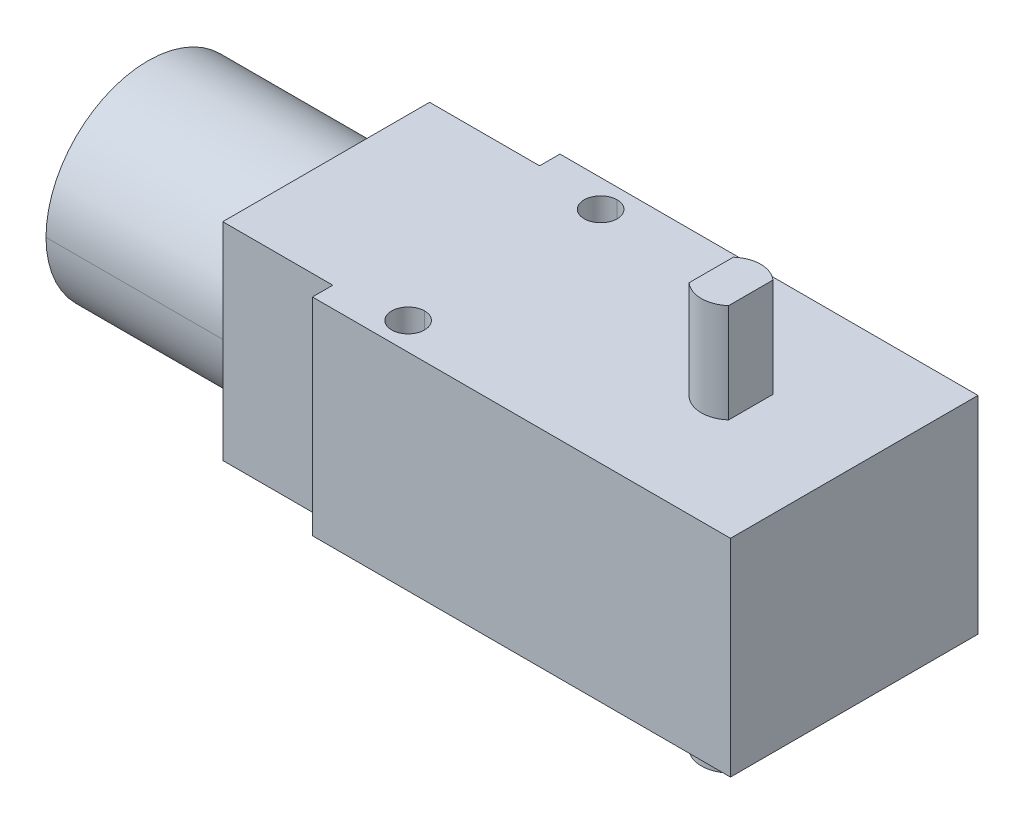
ISO-10303-21;
HEADER;
FILE_DESCRIPTION(('STEP AP214'),'2;1');
FILE_NAME('part.step','',(''),(''),'','','');
FILE_SCHEMA(('AUTOMOTIVE_DESIGN { 1 0 10303 214 1 1 1 1 }'));
ENDSEC;
DATA;
#1=APPLICATION_CONTEXT('core data for automotive mechanical design processes');
#2=APPLICATION_PROTOCOL_DEFINITION('international standard','automotive_design',2000,#1);
#3=PRODUCT_CONTEXT('',#1,'mechanical');
#4=PRODUCT('Part','Part','',(#3));
#5=PRODUCT_RELATED_PRODUCT_CATEGORY('part','',(#4));
#6=PRODUCT_DEFINITION_FORMATION('','',#4);
#7=PRODUCT_DEFINITION_CONTEXT('part definition',#1,'design');
#8=PRODUCT_DEFINITION('design','',#6,#7);
#9=PRODUCT_DEFINITION_SHAPE('','',#8);
#10=(LENGTH_UNIT() NAMED_UNIT(*) SI_UNIT(.MILLI.,.METRE.));
#11=(NAMED_UNIT(*) PLANE_ANGLE_UNIT() SI_UNIT($,.RADIAN.));
#12=(NAMED_UNIT(*) SI_UNIT($,.STERADIAN.) SOLID_ANGLE_UNIT());
#13=UNCERTAINTY_MEASURE_WITH_UNIT(LENGTH_MEASURE(1.E-05),#10,'distance_accuracy_value','');
#14=(GEOMETRIC_REPRESENTATION_CONTEXT(3) GLOBAL_UNCERTAINTY_ASSIGNED_CONTEXT((#13)) GLOBAL_UNIT_ASSIGNED_CONTEXT((#10,
#11,#12)) REPRESENTATION_CONTEXT('',''));
#15=CARTESIAN_POINT('',(0.,0.,0.));
#16=DIRECTION('',(0.,0.,1.));
#17=DIRECTION('',(1.,0.,0.));
#18=AXIS2_PLACEMENT_3D('',#15,#16,#17);
#19=CARTESIAN_POINT('',(0.,0.,0.));
#20=DIRECTION('',(0.,1.,0.));
#21=DIRECTION('',(1.,0.,0.));
#22=AXIS2_PLACEMENT_3D('',#19,#20,#21);
#23=PLANE('',#22);
#24=DIRECTION('',(0.,0.,-1.));
#25=VECTOR('',#24,1.);
#26=CARTESIAN_POINT('',(19.,0.,-11.25));
#27=LINE('',#26,#25);
#28=CARTESIAN_POINT('',(19.,0.,11.25));
#29=VERTEX_POINT('',#28);
#30=CARTESIAN_POINT('',(19.,0.,-11.25));
#31=VERTEX_POINT('',#30);
#32=EDGE_CURVE('E366',#29,#31,#27,.T.);
#33=ORIENTED_EDGE('',*,*,#32,.F.);
#34=DIRECTION('',(1.,0.,0.));
#35=VECTOR('',#34,1.);
#36=CARTESIAN_POINT('',(-19.,0.,11.25));
#37=LINE('',#36,#35);
#38=CARTESIAN_POINT('',(-19.,0.,11.25));
#39=VERTEX_POINT('',#38);
#40=EDGE_CURVE('E346',#39,#29,#37,.T.);
#41=ORIENTED_EDGE('',*,*,#40,.F.);
#42=DIRECTION('',(0.,0.,1.));
#43=VECTOR('',#42,1.);
#44=CARTESIAN_POINT('',(-19.,0.,-11.25));
#45=LINE('',#44,#43);
#46=CARTESIAN_POINT('',(-19.,0.,9.4));
#47=VERTEX_POINT('',#46);
#48=EDGE_CURVE('E320',#47,#39,#45,.T.);
#49=ORIENTED_EDGE('',*,*,#48,.F.);
#50=DIRECTION('',(1.,0.,0.));
#51=VECTOR('',#50,1.);
#52=CARTESIAN_POINT('',(-29.,0.,9.4));
#53=LINE('',#52,#51);
#54=CARTESIAN_POINT('',(-29.,0.,9.4));
#55=VERTEX_POINT('',#54);
#56=EDGE_CURVE('E354',#55,#47,#53,.T.);
#57=ORIENTED_EDGE('',*,*,#56,.F.);
#58=DIRECTION('',(0.,0.,1.));
#59=VECTOR('',#58,1.);
#60=CARTESIAN_POINT('',(-29.,0.,-9.4));
#61=LINE('',#60,#59);
#62=CARTESIAN_POINT('',(-29.,0.,-9.4));
#63=VERTEX_POINT('',#62);
#64=EDGE_CURVE('E357',#63,#55,#61,.T.);
#65=ORIENTED_EDGE('',*,*,#64,.F.);
#66=DIRECTION('',(1.,0.,0.));
#67=VECTOR('',#66,1.);
#68=CARTESIAN_POINT('',(-29.,0.,-9.4));
#69=LINE('',#68,#67);
#70=CARTESIAN_POINT('',(-19.,0.,-9.4));
#71=VERTEX_POINT('',#70);
#72=EDGE_CURVE('E385',#63,#71,#69,.T.);
#73=ORIENTED_EDGE('',*,*,#72,.T.);
#74=DIRECTION('',(0.,0.,1.));
#75=VECTOR('',#74,1.);
#76=CARTESIAN_POINT('',(-19.,0.,-11.25));
#77=LINE('',#76,#75);
#78=CARTESIAN_POINT('',(-19.,0.,-11.25));
#79=VERTEX_POINT('',#78);
#80=EDGE_CURVE('E362',#79,#71,#77,.T.);
#81=ORIENTED_EDGE('',*,*,#80,.F.);
#82=DIRECTION('',(-1.,0.,0.));
#83=VECTOR('',#82,1.);
#84=CARTESIAN_POINT('',(-19.,0.,-11.25));
#85=LINE('',#84,#83);
#86=EDGE_CURVE('E347',#31,#79,#85,.T.);
#87=ORIENTED_EDGE('',*,*,#86,.F.);
#88=EDGE_LOOP('',(#33,#41,#49,#57,#65,#73,#81,#87));
#89=FACE_BOUND('',#88,.T.);
#90=CARTESIAN_POINT('',(-12.8,0.,-8.75));
#91=DIRECTION('',(0.,1.,0.));
#92=DIRECTION('',(0.,0.,1.));
#93=AXIS2_PLACEMENT_3D('',#90,#91,#92);
#94=CIRCLE('',#93,1.5);
#95=CARTESIAN_POINT('',(-12.8,0.,-7.25));
#96=VERTEX_POINT('',#95);
#97=CARTESIAN_POINT('',(-12.8,0.,-10.25));
#98=VERTEX_POINT('',#97);
#99=EDGE_CURVE('E428',#96,#98,#94,.T.);
#100=ORIENTED_EDGE('',*,*,#99,.T.);
#101=CARTESIAN_POINT('',(-12.8,0.,-8.75));
#102=DIRECTION('',(0.,1.,0.));
#103=DIRECTION('',(0.,0.,1.));
#104=AXIS2_PLACEMENT_3D('',#101,#102,#103);
#105=CIRCLE('',#104,1.5);
#106=EDGE_CURVE('E291',#98,#96,#105,.T.);
#107=ORIENTED_EDGE('',*,*,#106,.T.);
#108=EDGE_LOOP('',(#100,#107));
#109=FACE_BOUND('',#108,.T.);
#110=CARTESIAN_POINT('',(-12.8,0.,8.75));
#111=DIRECTION('',(0.,1.,0.));
#112=DIRECTION('',(0.,0.,1.));
#113=AXIS2_PLACEMENT_3D('',#110,#111,#112);
#114=CIRCLE('',#113,1.5);
#115=CARTESIAN_POINT('',(-12.8,0.,10.25));
#116=VERTEX_POINT('',#115);
#117=CARTESIAN_POINT('',(-12.8,0.,7.25));
#118=VERTEX_POINT('',#117);
#119=EDGE_CURVE('E431',#116,#118,#114,.T.);
#120=ORIENTED_EDGE('',*,*,#119,.T.);
#121=CARTESIAN_POINT('',(-12.8,0.,8.75));
#122=DIRECTION('',(0.,1.,0.));
#123=DIRECTION('',(0.,0.,1.));
#124=AXIS2_PLACEMENT_3D('',#121,#122,#123);
#125=CIRCLE('',#124,1.5);
#126=EDGE_CURVE('E324',#118,#116,#125,.T.);
#127=ORIENTED_EDGE('',*,*,#126,.T.);
#128=EDGE_LOOP('',(#120,#127));
#129=FACE_BOUND('',#128,.T.);
#130=CARTESIAN_POINT('',(7.8,0.,0.));
#131=DIRECTION('',(0.,-1.,0.));
#132=DIRECTION('',(0.,0.,-1.));
#133=AXIS2_PLACEMENT_3D('',#130,#131,#132);
#134=CIRCLE('',#133,2.7);
#135=CARTESIAN_POINT('',(9.6,0.,2.01246117974981));
#136=VERTEX_POINT('',#135);
#137=CARTESIAN_POINT('',(6.,0.,2.01246117974981));
#138=VERTEX_POINT('',#137);
#139=EDGE_CURVE('E230',#136,#138,#134,.T.);
#140=ORIENTED_EDGE('',*,*,#139,.F.);
#141=DIRECTION('',(0.,0.,1.));
#142=VECTOR('',#141,1.);
#143=CARTESIAN_POINT('',(9.6,0.,2.01246117974981));
#144=LINE('',#143,#142);
#145=CARTESIAN_POINT('',(9.6,0.,-2.01246117974981));
#146=VERTEX_POINT('',#145);
#147=EDGE_CURVE('E263',#146,#136,#144,.T.);
#148=ORIENTED_EDGE('',*,*,#147,.F.);
#149=CARTESIAN_POINT('',(7.8,0.,0.));
#150=DIRECTION('',(0.,-1.,0.));
#151=DIRECTION('',(0.,0.,-1.));
#152=AXIS2_PLACEMENT_3D('',#149,#150,#151);
#153=CIRCLE('',#152,2.7);
#154=CARTESIAN_POINT('',(6.,0.,-2.01246117974981));
#155=VERTEX_POINT('',#154);
#156=EDGE_CURVE('E275',#155,#146,#153,.T.);
#157=ORIENTED_EDGE('',*,*,#156,.F.);
#158=DIRECTION('',(0.,0.,-1.));
#159=VECTOR('',#158,1.);
#160=CARTESIAN_POINT('',(6.,0.,2.01246117974981));
#161=LINE('',#160,#159);
#162=EDGE_CURVE('E272',#138,#155,#161,.T.);
#163=ORIENTED_EDGE('',*,*,#162,.F.);
#164=EDGE_LOOP('',(#140,#148,#157,#163));
#165=FACE_BOUND('',#164,.T.);
#166=ADVANCED_FACE('F45',(#89,#109,#129,#165),#23,.F.);
#167=CARTESIAN_POINT('',(-12.8,0.,-8.75));
#168=DIRECTION('',(0.,1.,0.));
#169=DIRECTION('',(0.,0.,1.));
#170=AXIS2_PLACEMENT_3D('',#167,#168,#169);
#171=CYLINDRICAL_SURFACE('',#170,1.5);
#172=DIRECTION('',(0.,1.,0.));
#173=VECTOR('',#172,1.);
#174=CARTESIAN_POINT('',(-12.8,0.,-10.25));
#175=LINE('',#174,#173);
#176=CARTESIAN_POINT('',(-12.8,18.8,-10.25));
#177=VERTEX_POINT('',#176);
#178=EDGE_CURVE('E298',#98,#177,#175,.T.);
#179=ORIENTED_EDGE('',*,*,#178,.F.);
#180=ORIENTED_EDGE('',*,*,#99,.F.);
#181=DIRECTION('',(0.,1.,0.));
#182=VECTOR('',#181,1.);
#183=CARTESIAN_POINT('',(-12.8,0.,-7.25));
#184=LINE('',#183,#182);
#185=CARTESIAN_POINT('',(-12.8,18.8,-7.25));
#186=VERTEX_POINT('',#185);
#187=EDGE_CURVE('E314',#96,#186,#184,.T.);
#188=ORIENTED_EDGE('',*,*,#187,.T.);
#189=CARTESIAN_POINT('',(-12.8,18.8,-8.75));
#190=DIRECTION('',(0.,1.,0.));
#191=DIRECTION('',(0.,0.,1.));
#192=AXIS2_PLACEMENT_3D('',#189,#190,#191);
#193=CIRCLE('',#192,1.5);
#194=EDGE_CURVE('E421',#186,#177,#193,.T.);
#195=ORIENTED_EDGE('',*,*,#194,.T.);
#196=EDGE_LOOP('',(#179,#180,#188,#195));
#197=FACE_BOUND('',#196,.T.);
#198=ADVANCED_FACE('F47',(#197),#171,.F.);
#199=CARTESIAN_POINT('',(-12.8,0.,8.75));
#200=DIRECTION('',(0.,1.,0.));
#201=DIRECTION('',(0.,0.,1.));
#202=AXIS2_PLACEMENT_3D('',#199,#200,#201);
#203=CYLINDRICAL_SURFACE('',#202,1.5);
#204=DIRECTION('',(0.,1.,0.));
#205=VECTOR('',#204,1.);
#206=CARTESIAN_POINT('',(-12.8,0.,7.25));
#207=LINE('',#206,#205);
#208=CARTESIAN_POINT('',(-12.8,18.8,7.25));
#209=VERTEX_POINT('',#208);
#210=EDGE_CURVE('E328',#118,#209,#207,.T.);
#211=ORIENTED_EDGE('',*,*,#210,.F.);
#212=ORIENTED_EDGE('',*,*,#119,.F.);
#213=DIRECTION('',(0.,1.,0.));
#214=VECTOR('',#213,1.);
#215=CARTESIAN_POINT('',(-12.8,0.,10.25));
#216=LINE('',#215,#214);
#217=CARTESIAN_POINT('',(-12.8,18.8,10.25));
#218=VERTEX_POINT('',#217);
#219=EDGE_CURVE('E339',#116,#218,#216,.T.);
#220=ORIENTED_EDGE('',*,*,#219,.T.);
#221=CARTESIAN_POINT('',(-12.8,18.8,8.75));
#222=DIRECTION('',(0.,1.,0.));
#223=DIRECTION('',(0.,0.,1.));
#224=AXIS2_PLACEMENT_3D('',#221,#222,#223);
#225=CIRCLE('',#224,1.5);
#226=EDGE_CURVE('E358',#218,#209,#225,.T.);
#227=ORIENTED_EDGE('',*,*,#226,.T.);
#228=EDGE_LOOP('',(#211,#212,#220,#227));
#229=FACE_BOUND('',#228,.T.);
#230=ADVANCED_FACE('F495',(#229),#203,.F.);
#231=CARTESIAN_POINT('',(-45.2,9.4,0.));
#232=DIRECTION('',(-1.,0.,0.));
#233=DIRECTION('',(0.,0.,1.));
#234=AXIS2_PLACEMENT_3D('',#231,#232,#233);
#235=PLANE('',#234);
#236=CARTESIAN_POINT('',(-45.2,9.4,0.));
#237=DIRECTION('',(-1.,0.,0.));
#238=DIRECTION('',(0.,0.,1.));
#239=AXIS2_PLACEMENT_3D('',#236,#237,#238);
#240=CIRCLE('',#239,9.26789771154907);
#241=CARTESIAN_POINT('',(-45.2,9.4,-9.26789771154907));
#242=VERTEX_POINT('',#241);
#243=CARTESIAN_POINT('',(-45.2,9.4,9.26789771154907));
#244=VERTEX_POINT('',#243);
#245=EDGE_CURVE('E11',#242,#244,#240,.T.);
#246=ORIENTED_EDGE('',*,*,#245,.T.);
#247=CARTESIAN_POINT('',(-45.2,9.4,0.));
#248=DIRECTION('',(-1.,0.,0.));
#249=DIRECTION('',(0.,0.,1.));
#250=AXIS2_PLACEMENT_3D('',#247,#248,#249);
#251=CIRCLE('',#250,9.26789771154907);
#252=EDGE_CURVE('E297',#244,#242,#251,.T.);
#253=ORIENTED_EDGE('',*,*,#252,.T.);
#254=EDGE_LOOP('',(#246,#253));
#255=FACE_BOUND('',#254,.T.);
#256=ADVANCED_FACE('F502',(#255),#235,.T.);
#257=CARTESIAN_POINT('',(-45.2,9.4,0.));
#258=DIRECTION('',(1.,0.,0.));
#259=DIRECTION('',(0.,0.,-1.));
#260=AXIS2_PLACEMENT_3D('',#257,#258,#259);
#261=CYLINDRICAL_SURFACE('',#260,9.26789771154907);
#262=DIRECTION('',(1.,0.,0.));
#263=VECTOR('',#262,1.);
#264=CARTESIAN_POINT('',(-45.2,9.4,9.26789771154907));
#265=LINE('',#264,#263);
#266=CARTESIAN_POINT('',(-29.,9.4,9.26789771154907));
#267=VERTEX_POINT('',#266);
#268=EDGE_CURVE('E292',#244,#267,#265,.T.);
#269=ORIENTED_EDGE('',*,*,#268,.F.);
#270=ORIENTED_EDGE('',*,*,#245,.F.);
#271=DIRECTION('',(1.,0.,0.));
#272=VECTOR('',#271,1.);
#273=CARTESIAN_POINT('',(-45.2,9.4,-9.26789771154907));
#274=LINE('',#273,#272);
#275=CARTESIAN_POINT('',(-29.,9.4,-9.26789771154907));
#276=VERTEX_POINT('',#275);
#277=EDGE_CURVE('E306',#242,#276,#274,.T.);
#278=ORIENTED_EDGE('',*,*,#277,.T.);
#279=CARTESIAN_POINT('',(-29.,9.4,0.));
#280=DIRECTION('',(-1.,0.,0.));
#281=DIRECTION('',(0.,0.,1.));
#282=AXIS2_PLACEMENT_3D('',#279,#280,#281);
#283=CIRCLE('',#282,9.26789771154907);
#284=EDGE_CURVE('E54',#276,#267,#283,.T.);
#285=ORIENTED_EDGE('',*,*,#284,.T.);
#286=EDGE_LOOP('',(#269,#270,#278,#285));
#287=FACE_BOUND('',#286,.T.);
#288=ADVANCED_FACE('F499',(#287),#261,.T.);
#289=CARTESIAN_POINT('',(-29.,0.,0.));
#290=DIRECTION('',(-1.,0.,0.));
#291=DIRECTION('',(0.,0.,1.));
#292=AXIS2_PLACEMENT_3D('',#289,#290,#291);
#293=PLANE('',#292);
#294=ORIENTED_EDGE('',*,*,#284,.F.);
#295=CARTESIAN_POINT('',(-29.,9.4,0.));
#296=DIRECTION('',(-1.,0.,0.));
#297=DIRECTION('',(0.,0.,1.));
#298=AXIS2_PLACEMENT_3D('',#295,#296,#297);
#299=CIRCLE('',#298,9.26789771154907);
#300=EDGE_CURVE('E296',#267,#276,#299,.T.);
#301=ORIENTED_EDGE('',*,*,#300,.F.);
#302=EDGE_LOOP('',(#294,#301));
#303=FACE_BOUND('',#302,.T.);
#304=DIRECTION('',(0.,1.,0.));
#305=VECTOR('',#304,1.);
#306=CARTESIAN_POINT('',(-29.,18.8,9.4));
#307=LINE('',#306,#305);
#308=CARTESIAN_POINT('',(-29.,18.8,9.4));
#309=VERTEX_POINT('',#308);
#310=EDGE_CURVE('E434',#55,#309,#307,.T.);
#311=ORIENTED_EDGE('',*,*,#310,.T.);
#312=DIRECTION('',(0.,0.,-1.));
#313=VECTOR('',#312,1.);
#314=CARTESIAN_POINT('',(-29.,18.8,-9.4));
#315=LINE('',#314,#313);
#316=CARTESIAN_POINT('',(-29.,18.8,-9.4));
#317=VERTEX_POINT('',#316);
#318=EDGE_CURVE('E409',#309,#317,#315,.T.);
#319=ORIENTED_EDGE('',*,*,#318,.T.);
#320=DIRECTION('',(0.,-1.,0.));
#321=VECTOR('',#320,1.);
#322=CARTESIAN_POINT('',(-29.,18.8,-9.4));
#323=LINE('',#322,#321);
#324=EDGE_CURVE('E418',#317,#63,#323,.T.);
#325=ORIENTED_EDGE('',*,*,#324,.T.);
#326=ORIENTED_EDGE('',*,*,#64,.T.);
#327=EDGE_LOOP('',(#311,#319,#325,#326));
#328=FACE_BOUND('',#327,.T.);
#329=ADVANCED_FACE('F441',(#303,#328),#293,.T.);
#330=CARTESIAN_POINT('',(-29.,18.8,-9.4));
#331=DIRECTION('',(0.,0.,1.));
#332=DIRECTION('',(1.,0.,0.));
#333=AXIS2_PLACEMENT_3D('',#330,#331,#332);
#334=PLANE('',#333);
#335=DIRECTION('',(0.,-1.,0.));
#336=VECTOR('',#335,1.);
#337=CARTESIAN_POINT('',(-19.,18.8,-9.4));
#338=LINE('',#337,#336);
#339=CARTESIAN_POINT('',(-19.,18.8,-9.4));
#340=VERTEX_POINT('',#339);
#341=EDGE_CURVE('E371',#340,#71,#338,.T.);
#342=ORIENTED_EDGE('',*,*,#341,.T.);
#343=ORIENTED_EDGE('',*,*,#72,.F.);
#344=ORIENTED_EDGE('',*,*,#324,.F.);
#345=DIRECTION('',(1.,0.,0.));
#346=VECTOR('',#345,1.);
#347=CARTESIAN_POINT('',(-29.,18.8,-9.4));
#348=LINE('',#347,#346);
#349=EDGE_CURVE('E406',#317,#340,#348,.T.);
#350=ORIENTED_EDGE('',*,*,#349,.T.);
#351=EDGE_LOOP('',(#342,#343,#344,#350));
#352=FACE_BOUND('',#351,.T.);
#353=ADVANCED_FACE('F447',(#352),#334,.F.);
#354=CARTESIAN_POINT('',(-29.,18.8,9.4));
#355=DIRECTION('',(0.,0.,-1.));
#356=DIRECTION('',(0.,-1.,0.));
#357=AXIS2_PLACEMENT_3D('',#354,#355,#356);
#358=PLANE('',#357);
#359=DIRECTION('',(0.,1.,0.));
#360=VECTOR('',#359,1.);
#361=CARTESIAN_POINT('',(-19.,18.8,9.4));
#362=LINE('',#361,#360);
#363=CARTESIAN_POINT('',(-19.,18.8,9.4));
#364=VERTEX_POINT('',#363);
#365=EDGE_CURVE('E310',#47,#364,#362,.T.);
#366=ORIENTED_EDGE('',*,*,#365,.T.);
#367=DIRECTION('',(1.,0.,0.));
#368=VECTOR('',#367,1.);
#369=CARTESIAN_POINT('',(-29.,18.8,9.4));
#370=LINE('',#369,#368);
#371=EDGE_CURVE('E415',#309,#364,#370,.T.);
#372=ORIENTED_EDGE('',*,*,#371,.F.);
#373=ORIENTED_EDGE('',*,*,#310,.F.);
#374=ORIENTED_EDGE('',*,*,#56,.T.);
#375=EDGE_LOOP('',(#366,#372,#373,#374));
#376=FACE_BOUND('',#375,.T.);
#377=ADVANCED_FACE('F456',(#376),#358,.F.);
#378=CARTESIAN_POINT('',(0.,18.8,0.));
#379=DIRECTION('',(0.,1.,0.));
#380=DIRECTION('',(1.,0.,0.));
#381=AXIS2_PLACEMENT_3D('',#378,#379,#380);
#382=PLANE('',#381);
#383=CARTESIAN_POINT('',(7.8,18.8,0.));
#384=DIRECTION('',(0.,-1.,0.));
#385=DIRECTION('',(0.,0.,-1.));
#386=AXIS2_PLACEMENT_3D('',#383,#384,#385);
#387=CIRCLE('',#386,2.7);
#388=CARTESIAN_POINT('',(9.6,18.8,2.01246117974981));
#389=VERTEX_POINT('',#388);
#390=CARTESIAN_POINT('',(6.,18.8,2.01246117974981));
#391=VERTEX_POINT('',#390);
#392=EDGE_CURVE('E227',#389,#391,#387,.T.);
#393=ORIENTED_EDGE('',*,*,#392,.T.);
#394=DIRECTION('',(0.,0.,-1.));
#395=VECTOR('',#394,1.);
#396=CARTESIAN_POINT('',(6.,18.8,2.01246117974981));
#397=LINE('',#396,#395);
#398=CARTESIAN_POINT('',(6.,18.8,-2.01246117974981));
#399=VERTEX_POINT('',#398);
#400=EDGE_CURVE('E241',#391,#399,#397,.T.);
#401=ORIENTED_EDGE('',*,*,#400,.T.);
#402=CARTESIAN_POINT('',(7.8,18.8,0.));
#403=DIRECTION('',(0.,-1.,0.));
#404=DIRECTION('',(0.,0.,-1.));
#405=AXIS2_PLACEMENT_3D('',#402,#403,#404);
#406=CIRCLE('',#405,2.7);
#407=CARTESIAN_POINT('',(9.6,18.8,-2.01246117974981));
#408=VERTEX_POINT('',#407);
#409=EDGE_CURVE('E66',#399,#408,#406,.T.);
#410=ORIENTED_EDGE('',*,*,#409,.T.);
#411=DIRECTION('',(0.,0.,1.));
#412=VECTOR('',#411,1.);
#413=CARTESIAN_POINT('',(9.6,18.8,2.01246117974981));
#414=LINE('',#413,#412);
#415=EDGE_CURVE('E61',#408,#389,#414,.T.);
#416=ORIENTED_EDGE('',*,*,#415,.T.);
#417=EDGE_LOOP('',(#393,#401,#410,#416));
#418=FACE_BOUND('',#417,.T.);
#419=ORIENTED_EDGE('',*,*,#226,.F.);
#420=CARTESIAN_POINT('',(-12.8,18.8,8.75));
#421=DIRECTION('',(0.,1.,0.));
#422=DIRECTION('',(0.,0.,1.));
#423=AXIS2_PLACEMENT_3D('',#420,#421,#422);
#424=CIRCLE('',#423,1.5);
#425=EDGE_CURVE('E335',#209,#218,#424,.T.);
#426=ORIENTED_EDGE('',*,*,#425,.F.);
#427=EDGE_LOOP('',(#419,#426));
#428=FACE_BOUND('',#427,.T.);
#429=ORIENTED_EDGE('',*,*,#194,.F.);
#430=CARTESIAN_POINT('',(-12.8,18.8,-8.75));
#431=DIRECTION('',(0.,1.,0.));
#432=DIRECTION('',(0.,0.,1.));
#433=AXIS2_PLACEMENT_3D('',#430,#431,#432);
#434=CIRCLE('',#433,1.5);
#435=EDGE_CURVE('E302',#177,#186,#434,.T.);
#436=ORIENTED_EDGE('',*,*,#435,.F.);
#437=EDGE_LOOP('',(#429,#436));
#438=FACE_BOUND('',#437,.T.);
#439=DIRECTION('',(0.,0.,-1.));
#440=VECTOR('',#439,1.);
#441=CARTESIAN_POINT('',(19.,18.8,-11.25));
#442=LINE('',#441,#440);
#443=CARTESIAN_POINT('',(19.,18.8,11.25));
#444=VERTEX_POINT('',#443);
#445=CARTESIAN_POINT('',(19.,18.8,-11.25));
#446=VERTEX_POINT('',#445);
#447=EDGE_CURVE('E393',#444,#446,#442,.T.);
#448=ORIENTED_EDGE('',*,*,#447,.T.);
#449=DIRECTION('',(-1.,0.,0.));
#450=VECTOR('',#449,1.);
#451=CARTESIAN_POINT('',(-19.,18.8,-11.25));
#452=LINE('',#451,#450);
#453=CARTESIAN_POINT('',(-19.,18.8,-11.25));
#454=VERTEX_POINT('',#453);
#455=EDGE_CURVE('E343',#446,#454,#452,.T.);
#456=ORIENTED_EDGE('',*,*,#455,.T.);
#457=DIRECTION('',(0.,0.,1.));
#458=VECTOR('',#457,1.);
#459=CARTESIAN_POINT('',(-19.,18.8,-11.25));
#460=LINE('',#459,#458);
#461=EDGE_CURVE('E375',#454,#340,#460,.T.);
#462=ORIENTED_EDGE('',*,*,#461,.T.);
#463=ORIENTED_EDGE('',*,*,#349,.F.);
#464=ORIENTED_EDGE('',*,*,#318,.F.);
#465=ORIENTED_EDGE('',*,*,#371,.T.);
#466=DIRECTION('',(0.,0.,1.));
#467=VECTOR('',#466,1.);
#468=CARTESIAN_POINT('',(-19.,18.8,-11.25));
#469=LINE('',#468,#467);
#470=CARTESIAN_POINT('',(-19.,18.8,11.25));
#471=VERTEX_POINT('',#470);
#472=EDGE_CURVE('E319',#364,#471,#469,.T.);
#473=ORIENTED_EDGE('',*,*,#472,.T.);
#474=DIRECTION('',(1.,0.,0.));
#475=VECTOR('',#474,1.);
#476=CARTESIAN_POINT('',(-19.,18.8,11.25));
#477=LINE('',#476,#475);
#478=EDGE_CURVE('E400',#471,#444,#477,.T.);
#479=ORIENTED_EDGE('',*,*,#478,.T.);
#480=EDGE_LOOP('',(#448,#456,#462,#463,#464,#465,#473,#479));
#481=FACE_BOUND('',#480,.T.);
#482=ADVANCED_FACE('F460',(#418,#428,#438,#481),#382,.T.);
#483=CARTESIAN_POINT('',(-19.,18.8,11.25));
#484=DIRECTION('',(0.,0.,-1.));
#485=DIRECTION('',(0.,-1.,0.));
#486=AXIS2_PLACEMENT_3D('',#483,#484,#485);
#487=PLANE('',#486);
#488=ORIENTED_EDGE('',*,*,#40,.T.);
#489=DIRECTION('',(0.,-1.,0.));
#490=VECTOR('',#489,1.);
#491=CARTESIAN_POINT('',(19.,18.8,11.25));
#492=LINE('',#491,#490);
#493=EDGE_CURVE('E397',#444,#29,#492,.T.);
#494=ORIENTED_EDGE('',*,*,#493,.F.);
#495=ORIENTED_EDGE('',*,*,#478,.F.);
#496=DIRECTION('',(0.,-1.,0.));
#497=VECTOR('',#496,1.);
#498=CARTESIAN_POINT('',(-19.,18.8,11.25));
#499=LINE('',#498,#497);
#500=EDGE_CURVE('E315',#471,#39,#499,.T.);
#501=ORIENTED_EDGE('',*,*,#500,.T.);
#502=EDGE_LOOP('',(#488,#494,#495,#501));
#503=FACE_BOUND('',#502,.T.);
#504=ADVANCED_FACE('F473',(#503),#487,.F.);
#505=CARTESIAN_POINT('',(-19.,18.8,-11.25));
#506=DIRECTION('',(0.,0.,1.));
#507=DIRECTION('',(1.,0.,0.));
#508=AXIS2_PLACEMENT_3D('',#505,#506,#507);
#509=PLANE('',#508);
#510=ORIENTED_EDGE('',*,*,#86,.T.);
#511=DIRECTION('',(0.,-1.,0.));
#512=VECTOR('',#511,1.);
#513=CARTESIAN_POINT('',(-19.,18.8,-11.25));
#514=LINE('',#513,#512);
#515=EDGE_CURVE('E367',#454,#79,#514,.T.);
#516=ORIENTED_EDGE('',*,*,#515,.F.);
#517=ORIENTED_EDGE('',*,*,#455,.F.);
#518=DIRECTION('',(0.,-1.,0.));
#519=VECTOR('',#518,1.);
#520=CARTESIAN_POINT('',(19.,18.8,-11.25));
#521=LINE('',#520,#519);
#522=EDGE_CURVE('E389',#446,#31,#521,.T.);
#523=ORIENTED_EDGE('',*,*,#522,.T.);
#524=EDGE_LOOP('',(#510,#516,#517,#523));
#525=FACE_BOUND('',#524,.T.);
#526=ADVANCED_FACE('F467',(#525),#509,.F.);
#527=CARTESIAN_POINT('',(19.,18.8,-11.25));
#528=DIRECTION('',(-1.,0.,0.));
#529=DIRECTION('',(0.,1.,0.));
#530=AXIS2_PLACEMENT_3D('',#527,#528,#529);
#531=PLANE('',#530);
#532=ORIENTED_EDGE('',*,*,#32,.T.);
#533=ORIENTED_EDGE('',*,*,#522,.F.);
#534=ORIENTED_EDGE('',*,*,#447,.F.);
#535=ORIENTED_EDGE('',*,*,#493,.T.);
#536=EDGE_LOOP('',(#532,#533,#534,#535));
#537=FACE_BOUND('',#536,.T.);
#538=ADVANCED_FACE('F470',(#537),#531,.F.);
#539=CARTESIAN_POINT('',(-19.,18.8,-11.25));
#540=DIRECTION('',(1.,0.,0.));
#541=DIRECTION('',(0.,1.,0.));
#542=AXIS2_PLACEMENT_3D('',#539,#540,#541);
#543=PLANE('',#542);
#544=ORIENTED_EDGE('',*,*,#341,.F.);
#545=ORIENTED_EDGE('',*,*,#461,.F.);
#546=ORIENTED_EDGE('',*,*,#515,.T.);
#547=ORIENTED_EDGE('',*,*,#80,.T.);
#548=EDGE_LOOP('',(#544,#545,#546,#547));
#549=FACE_BOUND('',#548,.T.);
#550=ADVANCED_FACE('F464',(#549),#543,.F.);
#551=CARTESIAN_POINT('',(-19.,18.8,-11.25));
#552=DIRECTION('',(1.,0.,0.));
#553=DIRECTION('',(0.,1.,0.));
#554=AXIS2_PLACEMENT_3D('',#551,#552,#553);
#555=PLANE('',#554);
#556=ORIENTED_EDGE('',*,*,#365,.F.);
#557=ORIENTED_EDGE('',*,*,#48,.T.);
#558=ORIENTED_EDGE('',*,*,#500,.F.);
#559=ORIENTED_EDGE('',*,*,#472,.F.);
#560=EDGE_LOOP('',(#556,#557,#558,#559));
#561=FACE_BOUND('',#560,.T.);
#562=ADVANCED_FACE('F476',(#561),#555,.F.);
#563=CARTESIAN_POINT('',(-45.2,9.4,0.));
#564=DIRECTION('',(1.,0.,0.));
#565=DIRECTION('',(0.,0.,-1.));
#566=AXIS2_PLACEMENT_3D('',#563,#564,#565);
#567=CYLINDRICAL_SURFACE('',#566,9.26789771154907);
#568=ORIENTED_EDGE('',*,*,#252,.F.);
#569=ORIENTED_EDGE('',*,*,#268,.T.);
#570=ORIENTED_EDGE('',*,*,#300,.T.);
#571=ORIENTED_EDGE('',*,*,#277,.F.);
#572=EDGE_LOOP('',(#568,#569,#570,#571));
#573=FACE_BOUND('',#572,.T.);
#574=ADVANCED_FACE('F478',(#573),#567,.T.);
#575=CARTESIAN_POINT('',(-12.8,0.,8.75));
#576=DIRECTION('',(0.,1.,0.));
#577=DIRECTION('',(0.,0.,1.));
#578=AXIS2_PLACEMENT_3D('',#575,#576,#577);
#579=CYLINDRICAL_SURFACE('',#578,1.5);
#580=ORIENTED_EDGE('',*,*,#126,.F.);
#581=ORIENTED_EDGE('',*,*,#210,.T.);
#582=ORIENTED_EDGE('',*,*,#425,.T.);
#583=ORIENTED_EDGE('',*,*,#219,.F.);
#584=EDGE_LOOP('',(#580,#581,#582,#583));
#585=FACE_BOUND('',#584,.T.);
#586=ADVANCED_FACE('F484',(#585),#579,.F.);
#587=CARTESIAN_POINT('',(-12.8,0.,-8.75));
#588=DIRECTION('',(0.,1.,0.));
#589=DIRECTION('',(0.,0.,1.));
#590=AXIS2_PLACEMENT_3D('',#587,#588,#589);
#591=CYLINDRICAL_SURFACE('',#590,1.5);
#592=ORIENTED_EDGE('',*,*,#106,.F.);
#593=ORIENTED_EDGE('',*,*,#178,.T.);
#594=ORIENTED_EDGE('',*,*,#435,.T.);
#595=ORIENTED_EDGE('',*,*,#187,.F.);
#596=EDGE_LOOP('',(#592,#593,#594,#595));
#597=FACE_BOUND('',#596,.T.);
#598=ADVANCED_FACE('F538',(#597),#591,.F.);
#599=CARTESIAN_POINT('',(7.8,-9.,0.));
#600=DIRECTION('',(0.,1.,0.));
#601=DIRECTION('',(0.,0.,1.));
#602=AXIS2_PLACEMENT_3D('',#599,#600,#601);
#603=CYLINDRICAL_SURFACE('',#602,2.7);
#604=ORIENTED_EDGE('',*,*,#139,.T.);
#605=DIRECTION('',(0.,1.,0.));
#606=VECTOR('',#605,1.);
#607=CARTESIAN_POINT('',(6.,-9.,2.01246117974981));
#608=LINE('',#607,#606);
#609=CARTESIAN_POINT('',(6.,-9.,2.01246117974981));
#610=VERTEX_POINT('',#609);
#611=EDGE_CURVE('E288',#610,#138,#608,.T.);
#612=ORIENTED_EDGE('',*,*,#611,.F.);
#613=CARTESIAN_POINT('',(7.8,-9.,0.));
#614=DIRECTION('',(0.,-1.,0.));
#615=DIRECTION('',(0.,0.,-1.));
#616=AXIS2_PLACEMENT_3D('',#613,#614,#615);
#617=CIRCLE('',#616,2.7);
#618=CARTESIAN_POINT('',(9.6,-9.,2.01246117974981));
#619=VERTEX_POINT('',#618);
#620=EDGE_CURVE('E259',#619,#610,#617,.T.);
#621=ORIENTED_EDGE('',*,*,#620,.F.);
#622=DIRECTION('',(0.,1.,0.));
#623=VECTOR('',#622,1.);
#624=CARTESIAN_POINT('',(9.6,-9.,2.01246117974981));
#625=LINE('',#624,#623);
#626=EDGE_CURVE('E269',#619,#136,#625,.T.);
#627=ORIENTED_EDGE('',*,*,#626,.T.);
#628=EDGE_LOOP('',(#604,#612,#621,#627));
#629=FACE_BOUND('',#628,.T.);
#630=ADVANCED_FACE('F550',(#629),#603,.T.);
#631=CARTESIAN_POINT('',(6.,-9.,2.01246117974981));
#632=DIRECTION('',(1.,0.,0.));
#633=DIRECTION('',(0.,0.,-1.));
#634=AXIS2_PLACEMENT_3D('',#631,#632,#633);
#635=PLANE('',#634);
#636=ORIENTED_EDGE('',*,*,#162,.T.);
#637=DIRECTION('',(0.,1.,0.));
#638=VECTOR('',#637,1.);
#639=CARTESIAN_POINT('',(6.,-9.,-2.01246117974981));
#640=LINE('',#639,#638);
#641=CARTESIAN_POINT('',(6.,-9.,-2.01246117974981));
#642=VERTEX_POINT('',#641);
#643=EDGE_CURVE('E285',#642,#155,#640,.T.);
#644=ORIENTED_EDGE('',*,*,#643,.F.);
#645=DIRECTION('',(0.,0.,-1.));
#646=VECTOR('',#645,1.);
#647=CARTESIAN_POINT('',(6.,-9.,2.01246117974981));
#648=LINE('',#647,#646);
#649=EDGE_CURVE('E262',#610,#642,#648,.T.);
#650=ORIENTED_EDGE('',*,*,#649,.F.);
#651=ORIENTED_EDGE('',*,*,#611,.T.);
#652=EDGE_LOOP('',(#636,#644,#650,#651));
#653=FACE_BOUND('',#652,.T.);
#654=ADVANCED_FACE('F558',(#653),#635,.F.);
#655=CARTESIAN_POINT('',(7.8,-9.,0.));
#656=DIRECTION('',(0.,1.,0.));
#657=DIRECTION('',(0.,0.,1.));
#658=AXIS2_PLACEMENT_3D('',#655,#656,#657);
#659=CYLINDRICAL_SURFACE('',#658,2.7);
#660=ORIENTED_EDGE('',*,*,#156,.T.);
#661=DIRECTION('',(0.,1.,0.));
#662=VECTOR('',#661,1.);
#663=CARTESIAN_POINT('',(9.6,-9.,-2.01246117974981));
#664=LINE('',#663,#662);
#665=CARTESIAN_POINT('',(9.6,-9.,-2.01246117974981));
#666=VERTEX_POINT('',#665);
#667=EDGE_CURVE('E282',#666,#146,#664,.T.);
#668=ORIENTED_EDGE('',*,*,#667,.F.);
#669=CARTESIAN_POINT('',(7.8,-9.,0.));
#670=DIRECTION('',(0.,-1.,0.));
#671=DIRECTION('',(0.,0.,-1.));
#672=AXIS2_PLACEMENT_3D('',#669,#670,#671);
#673=CIRCLE('',#672,2.7);
#674=EDGE_CURVE('E265',#642,#666,#673,.T.);
#675=ORIENTED_EDGE('',*,*,#674,.F.);
#676=ORIENTED_EDGE('',*,*,#643,.T.);
#677=EDGE_LOOP('',(#660,#668,#675,#676));
#678=FACE_BOUND('',#677,.T.);
#679=ADVANCED_FACE('F556',(#678),#659,.T.);
#680=CARTESIAN_POINT('',(9.6,-9.,2.01246117974981));
#681=DIRECTION('',(-1.,0.,0.));
#682=DIRECTION('',(0.,0.,1.));
#683=AXIS2_PLACEMENT_3D('',#680,#681,#682);
#684=PLANE('',#683);
#685=ORIENTED_EDGE('',*,*,#147,.T.);
#686=ORIENTED_EDGE('',*,*,#626,.F.);
#687=DIRECTION('',(0.,0.,1.));
#688=VECTOR('',#687,1.);
#689=CARTESIAN_POINT('',(9.6,-9.,2.01246117974981));
#690=LINE('',#689,#688);
#691=EDGE_CURVE('E267',#666,#619,#690,.T.);
#692=ORIENTED_EDGE('',*,*,#691,.F.);
#693=ORIENTED_EDGE('',*,*,#667,.T.);
#694=EDGE_LOOP('',(#685,#686,#692,#693));
#695=FACE_BOUND('',#694,.T.);
#696=ADVANCED_FACE('F546',(#695),#684,.F.);
#697=CARTESIAN_POINT('',(7.8,-9.,0.));
#698=DIRECTION('',(0.,-1.,0.));
#699=DIRECTION('',(0.,0.,-1.));
#700=AXIS2_PLACEMENT_3D('',#697,#698,#699);
#701=PLANE('',#700);
#702=ORIENTED_EDGE('',*,*,#620,.T.);
#703=ORIENTED_EDGE('',*,*,#649,.T.);
#704=ORIENTED_EDGE('',*,*,#674,.T.);
#705=ORIENTED_EDGE('',*,*,#691,.T.);
#706=EDGE_LOOP('',(#702,#703,#704,#705));
#707=FACE_BOUND('',#706,.T.);
#708=ADVANCED_FACE('F552',(#707),#701,.T.);
#709=CARTESIAN_POINT('',(7.8,27.8,0.));
#710=DIRECTION('',(0.,-1.,0.));
#711=DIRECTION('',(0.,0.,-1.));
#712=AXIS2_PLACEMENT_3D('',#709,#710,#711);
#713=CYLINDRICAL_SURFACE('',#712,2.7);
#714=ORIENTED_EDGE('',*,*,#392,.F.);
#715=DIRECTION('',(0.,-1.,0.));
#716=VECTOR('',#715,1.);
#717=CARTESIAN_POINT('',(9.6,27.8,2.01246117974981));
#718=LINE('',#717,#716);
#719=CARTESIAN_POINT('',(9.6,27.8,2.01246117974981));
#720=VERTEX_POINT('',#719);
#721=EDGE_CURVE('E221',#720,#389,#718,.T.);
#722=ORIENTED_EDGE('',*,*,#721,.F.);
#723=CARTESIAN_POINT('',(7.8,27.8,0.));
#724=DIRECTION('',(0.,-1.,0.));
#725=DIRECTION('',(0.,0.,-1.));
#726=AXIS2_PLACEMENT_3D('',#723,#724,#725);
#727=CIRCLE('',#726,2.7);
#728=CARTESIAN_POINT('',(6.,27.8,2.01246117974981));
#729=VERTEX_POINT('',#728);
#730=EDGE_CURVE('E225',#720,#729,#727,.T.);
#731=ORIENTED_EDGE('',*,*,#730,.T.);
#732=DIRECTION('',(0.,-1.,0.));
#733=VECTOR('',#732,1.);
#734=CARTESIAN_POINT('',(6.,27.8,2.01246117974981));
#735=LINE('',#734,#733);
#736=EDGE_CURVE('E249',#729,#391,#735,.T.);
#737=ORIENTED_EDGE('',*,*,#736,.T.);
#738=EDGE_LOOP('',(#714,#722,#731,#737));
#739=FACE_BOUND('',#738,.T.);
#740=ADVANCED_FACE('F223',(#739),#713,.T.);
#741=CARTESIAN_POINT('',(9.6,27.8,2.01246117974981));
#742=DIRECTION('',(1.,0.,0.));
#743=DIRECTION('',(0.,0.,-1.));
#744=AXIS2_PLACEMENT_3D('',#741,#742,#743);
#745=PLANE('',#744);
#746=ORIENTED_EDGE('',*,*,#415,.F.);
#747=DIRECTION('',(0.,-1.,0.));
#748=VECTOR('',#747,1.);
#749=CARTESIAN_POINT('',(9.6,27.8,-2.01246117974981));
#750=LINE('',#749,#748);
#751=CARTESIAN_POINT('',(9.6,27.8,-2.01246117974981));
#752=VERTEX_POINT('',#751);
#753=EDGE_CURVE('E231',#752,#408,#750,.T.);
#754=ORIENTED_EDGE('',*,*,#753,.F.);
#755=DIRECTION('',(0.,0.,1.));
#756=VECTOR('',#755,1.);
#757=CARTESIAN_POINT('',(9.6,27.8,2.01246117974981));
#758=LINE('',#757,#756);
#759=EDGE_CURVE('E237',#752,#720,#758,.T.);
#760=ORIENTED_EDGE('',*,*,#759,.T.);
#761=ORIENTED_EDGE('',*,*,#721,.T.);
#762=EDGE_LOOP('',(#746,#754,#760,#761));
#763=FACE_BOUND('',#762,.T.);
#764=ADVANCED_FACE('F243',(#763),#745,.T.);
#765=CARTESIAN_POINT('',(7.8,27.8,0.));
#766=DIRECTION('',(0.,-1.,0.));
#767=DIRECTION('',(0.,0.,-1.));
#768=AXIS2_PLACEMENT_3D('',#765,#766,#767);
#769=CYLINDRICAL_SURFACE('',#768,2.7);
#770=ORIENTED_EDGE('',*,*,#409,.F.);
#771=DIRECTION('',(0.,-1.,0.));
#772=VECTOR('',#771,1.);
#773=CARTESIAN_POINT('',(6.,27.8,-2.01246117974981));
#774=LINE('',#773,#772);
#775=CARTESIAN_POINT('',(6.,27.8,-2.01246117974981));
#776=VERTEX_POINT('',#775);
#777=EDGE_CURVE('E255',#776,#399,#774,.T.);
#778=ORIENTED_EDGE('',*,*,#777,.F.);
#779=CARTESIAN_POINT('',(7.8,27.8,0.));
#780=DIRECTION('',(0.,-1.,0.));
#781=DIRECTION('',(0.,0.,-1.));
#782=AXIS2_PLACEMENT_3D('',#779,#780,#781);
#783=CIRCLE('',#782,2.7);
#784=EDGE_CURVE('E244',#776,#752,#783,.T.);
#785=ORIENTED_EDGE('',*,*,#784,.T.);
#786=ORIENTED_EDGE('',*,*,#753,.T.);
#787=EDGE_LOOP('',(#770,#778,#785,#786));
#788=FACE_BOUND('',#787,.T.);
#789=ADVANCED_FACE('F697',(#788),#769,.T.);
#790=CARTESIAN_POINT('',(6.,27.8,2.01246117974981));
#791=DIRECTION('',(-1.,0.,0.));
#792=DIRECTION('',(0.,0.,1.));
#793=AXIS2_PLACEMENT_3D('',#790,#791,#792);
#794=PLANE('',#793);
#795=ORIENTED_EDGE('',*,*,#400,.F.);
#796=ORIENTED_EDGE('',*,*,#736,.F.);
#797=DIRECTION('',(0.,0.,-1.));
#798=VECTOR('',#797,1.);
#799=CARTESIAN_POINT('',(6.,27.8,2.01246117974981));
#800=LINE('',#799,#798);
#801=EDGE_CURVE('E240',#729,#776,#800,.T.);
#802=ORIENTED_EDGE('',*,*,#801,.T.);
#803=ORIENTED_EDGE('',*,*,#777,.T.);
#804=EDGE_LOOP('',(#795,#796,#802,#803));
#805=FACE_BOUND('',#804,.T.);
#806=ADVANCED_FACE('F707',(#805),#794,.T.);
#807=CARTESIAN_POINT('',(7.8,27.8,0.));
#808=DIRECTION('',(0.,1.,0.));
#809=DIRECTION('',(0.,0.,-1.));
#810=AXIS2_PLACEMENT_3D('',#807,#808,#809);
#811=PLANE('',#810);
#812=ORIENTED_EDGE('',*,*,#730,.F.);
#813=ORIENTED_EDGE('',*,*,#759,.F.);
#814=ORIENTED_EDGE('',*,*,#784,.F.);
#815=ORIENTED_EDGE('',*,*,#801,.F.);
#816=EDGE_LOOP('',(#812,#813,#814,#815));
#817=FACE_BOUND('',#816,.T.);
#818=ADVANCED_FACE('F235',(#817),#811,.T.);
#819=CLOSED_SHELL('',(#166,#198,#230,#256,#288,#329,#353,#377,#482,#504,#526,#538,#550,#562,
#574,#586,#598,#630,#654,#679,#696,#708,#740,#764,#789,#806,#818));
#820=MANIFOLD_SOLID_BREP('B2',#819);
#821=ADVANCED_BREP_SHAPE_REPRESENTATION('',(#18,#820),#14);
#822=SHAPE_DEFINITION_REPRESENTATION(#9,#821);
ENDSEC;
END-ISO-10303-21;
